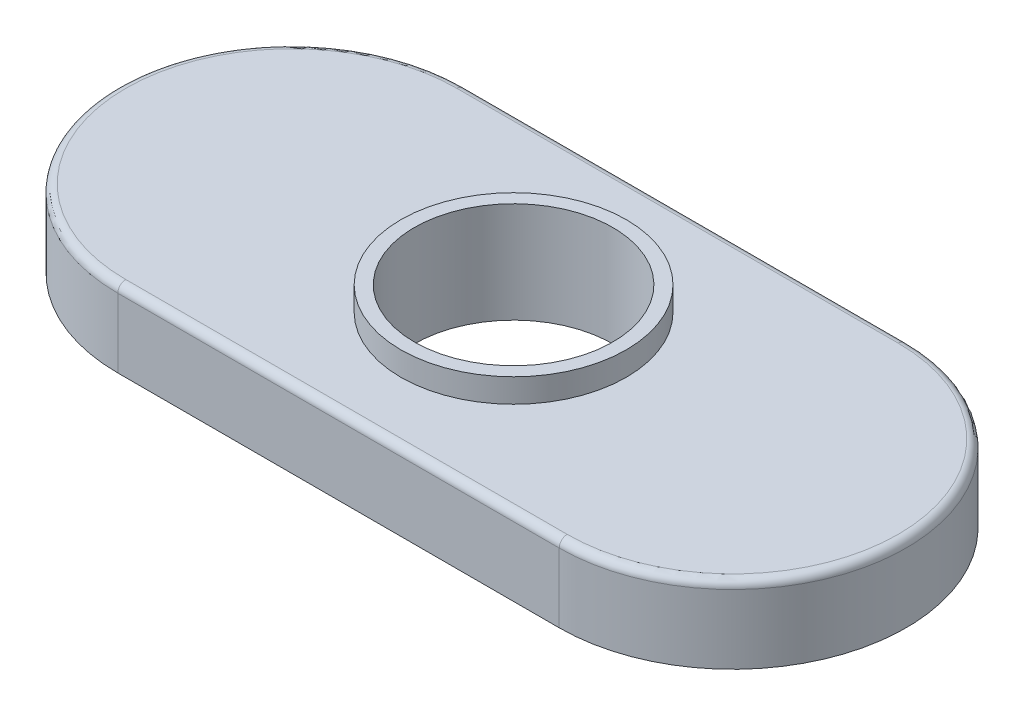
ISO-10303-21;
HEADER;
FILE_DESCRIPTION(('STEP AP214'),'2;1');
FILE_NAME('part.step','',(''),(''),'','','');
FILE_SCHEMA(('AUTOMOTIVE_DESIGN { 1 0 10303 214 1 1 1 1 }'));
ENDSEC;
DATA;
#1=APPLICATION_CONTEXT('core data for automotive mechanical design processes');
#2=APPLICATION_PROTOCOL_DEFINITION('international standard','automotive_design',2000,#1);
#3=PRODUCT_CONTEXT('',#1,'mechanical');
#4=PRODUCT('Part','Part','',(#3));
#5=PRODUCT_RELATED_PRODUCT_CATEGORY('part','',(#4));
#6=PRODUCT_DEFINITION_FORMATION('','',#4);
#7=PRODUCT_DEFINITION_CONTEXT('part definition',#1,'design');
#8=PRODUCT_DEFINITION('design','',#6,#7);
#9=PRODUCT_DEFINITION_SHAPE('','',#8);
#10=(LENGTH_UNIT() NAMED_UNIT(*) SI_UNIT(.MILLI.,.METRE.));
#11=(NAMED_UNIT(*) PLANE_ANGLE_UNIT() SI_UNIT($,.RADIAN.));
#12=(NAMED_UNIT(*) SI_UNIT($,.STERADIAN.) SOLID_ANGLE_UNIT());
#13=UNCERTAINTY_MEASURE_WITH_UNIT(LENGTH_MEASURE(1.E-05),#10,'distance_accuracy_value','');
#14=(GEOMETRIC_REPRESENTATION_CONTEXT(3) GLOBAL_UNCERTAINTY_ASSIGNED_CONTEXT((#13)) GLOBAL_UNIT_ASSIGNED_CONTEXT((#10,
#11,#12)) REPRESENTATION_CONTEXT('',''));
#15=CARTESIAN_POINT('',(0.,0.,0.));
#16=DIRECTION('',(0.,0.,1.));
#17=DIRECTION('',(1.,0.,0.));
#18=AXIS2_PLACEMENT_3D('',#15,#16,#17);
#19=CARTESIAN_POINT('',(0.,2.4638,0.));
#20=DIRECTION('',(0.,1.,0.));
#21=DIRECTION('',(0.,0.,1.));
#22=AXIS2_PLACEMENT_3D('',#19,#20,#21);
#23=PLANE('',#22);
#24=CARTESIAN_POINT('',(14.1224,2.4638,0.));
#25=DIRECTION('',(0.,1.,0.));
#26=DIRECTION('',(0.,0.,1.));
#27=AXIS2_PLACEMENT_3D('',#24,#25,#26);
#28=CIRCLE('',#27,5.2959);
#29=CARTESIAN_POINT('',(14.1224,2.4638,5.2959));
#30=VERTEX_POINT('',#29);
#31=CARTESIAN_POINT('',(14.1224,2.4638,-5.2959));
#32=VERTEX_POINT('',#31);
#33=EDGE_CURVE('E125',#30,#32,#28,.T.);
#34=ORIENTED_EDGE('',*,*,#33,.T.);
#35=DIRECTION('',(-1.,0.,0.));
#36=VECTOR('',#35,1.);
#37=CARTESIAN_POINT('',(0.,2.4638,-5.2959));
#38=LINE('',#37,#36);
#39=CARTESIAN_POINT('',(0.,2.4638,-5.2959));
#40=VERTEX_POINT('',#39);
#41=EDGE_CURVE('E127',#32,#40,#38,.T.);
#42=ORIENTED_EDGE('',*,*,#41,.T.);
#43=CARTESIAN_POINT('',(0.,2.4638,0.));
#44=DIRECTION('',(0.,1.,0.));
#45=DIRECTION('',(0.,0.,1.));
#46=AXIS2_PLACEMENT_3D('',#43,#44,#45);
#47=CIRCLE('',#46,5.2959);
#48=CARTESIAN_POINT('',(0.,2.4638,5.2959));
#49=VERTEX_POINT('',#48);
#50=EDGE_CURVE('E93',#40,#49,#47,.T.);
#51=ORIENTED_EDGE('',*,*,#50,.T.);
#52=DIRECTION('',(1.,0.,0.));
#53=VECTOR('',#52,1.);
#54=CARTESIAN_POINT('',(14.1224,2.4638,5.2959));
#55=LINE('',#54,#53);
#56=EDGE_CURVE('E123',#49,#30,#55,.T.);
#57=ORIENTED_EDGE('',*,*,#56,.T.);
#58=EDGE_LOOP('',(#34,#42,#51,#57));
#59=FACE_BOUND('',#58,.T.);
#60=CARTESIAN_POINT('',(7.112,2.4638,0.));
#61=DIRECTION('',(0.,1.,0.));
#62=DIRECTION('',(0.,0.,1.));
#63=AXIS2_PLACEMENT_3D('',#60,#61,#62);
#64=CIRCLE('',#63,3.6068);
#65=CARTESIAN_POINT('',(7.112,2.4638,-3.6068));
#66=VERTEX_POINT('',#65);
#67=EDGE_CURVE('E111',#66,#66,#64,.T.);
#68=ORIENTED_EDGE('',*,*,#67,.F.);
#69=EDGE_LOOP('',(#68));
#70=FACE_BOUND('',#69,.T.);
#71=ADVANCED_FACE('F33',(#59,#70),#23,.T.);
#72=CARTESIAN_POINT('',(0.,2.4638,0.));
#73=DIRECTION('',(0.,-1.,0.));
#74=DIRECTION('',(0.,0.,-1.));
#75=AXIS2_PLACEMENT_3D('',#72,#73,#74);
#76=CYLINDRICAL_SURFACE('',#75,5.5499);
#77=DIRECTION('',(0.,-1.,0.));
#78=VECTOR('',#77,1.);
#79=CARTESIAN_POINT('',(0.,2.4638,5.5499));
#80=LINE('',#79,#78);
#81=CARTESIAN_POINT('',(0.,2.2098,5.5499));
#82=VERTEX_POINT('',#81);
#83=CARTESIAN_POINT('',(0.,0.,5.5499));
#84=VERTEX_POINT('',#83);
#85=EDGE_CURVE('E85',#82,#84,#80,.T.);
#86=ORIENTED_EDGE('',*,*,#85,.F.);
#87=CARTESIAN_POINT('',(0.,2.2098,0.));
#88=DIRECTION('',(0.,1.,0.));
#89=DIRECTION('',(0.,0.,1.));
#90=AXIS2_PLACEMENT_3D('',#87,#88,#89);
#91=CIRCLE('',#90,5.5499);
#92=CARTESIAN_POINT('',(0.,2.2098,-5.5499));
#93=VERTEX_POINT('',#92);
#94=EDGE_CURVE('E11',#82,#93,#91,.F.);
#95=ORIENTED_EDGE('',*,*,#94,.T.);
#96=DIRECTION('',(0.,-1.,0.));
#97=VECTOR('',#96,1.);
#98=CARTESIAN_POINT('',(0.,2.4638,-5.5499));
#99=LINE('',#98,#97);
#100=CARTESIAN_POINT('',(0.,0.,-5.5499));
#101=VERTEX_POINT('',#100);
#102=EDGE_CURVE('E106',#93,#101,#99,.T.);
#103=ORIENTED_EDGE('',*,*,#102,.T.);
#104=CARTESIAN_POINT('',(0.,0.,0.));
#105=DIRECTION('',(0.,1.,0.));
#106=DIRECTION('',(0.,0.,1.));
#107=AXIS2_PLACEMENT_3D('',#104,#105,#106);
#108=CIRCLE('',#107,5.5499);
#109=EDGE_CURVE('E100',#101,#84,#108,.T.);
#110=ORIENTED_EDGE('',*,*,#109,.T.);
#111=EDGE_LOOP('',(#86,#95,#103,#110));
#112=FACE_BOUND('',#111,.T.);
#113=ADVANCED_FACE('F104',(#112),#76,.T.);
#114=CARTESIAN_POINT('',(0.,2.4638,5.5499));
#115=DIRECTION('',(0.,0.,-1.));
#116=DIRECTION('',(-1.,0.,0.));
#117=AXIS2_PLACEMENT_3D('',#114,#115,#116);
#118=PLANE('',#117);
#119=DIRECTION('',(0.,-1.,0.));
#120=VECTOR('',#119,1.);
#121=CARTESIAN_POINT('',(14.1224,2.4638,5.5499));
#122=LINE('',#121,#120);
#123=CARTESIAN_POINT('',(14.1224,2.2098,5.5499));
#124=VERTEX_POINT('',#123);
#125=CARTESIAN_POINT('',(14.1224,0.,5.5499));
#126=VERTEX_POINT('',#125);
#127=EDGE_CURVE('E94',#124,#126,#122,.T.);
#128=ORIENTED_EDGE('',*,*,#127,.F.);
#129=DIRECTION('',(1.,0.,0.));
#130=VECTOR('',#129,1.);
#131=CARTESIAN_POINT('',(0.,2.2098,5.5499));
#132=LINE('',#131,#130);
#133=EDGE_CURVE('E42',#124,#82,#132,.F.);
#134=ORIENTED_EDGE('',*,*,#133,.T.);
#135=ORIENTED_EDGE('',*,*,#85,.T.);
#136=DIRECTION('',(1.,0.,0.));
#137=VECTOR('',#136,1.);
#138=CARTESIAN_POINT('',(0.,0.,5.5499));
#139=LINE('',#138,#137);
#140=EDGE_CURVE('E88',#84,#126,#139,.T.);
#141=ORIENTED_EDGE('',*,*,#140,.T.);
#142=EDGE_LOOP('',(#128,#134,#135,#141));
#143=FACE_BOUND('',#142,.T.);
#144=ADVANCED_FACE('F87',(#143),#118,.F.);
#145=CARTESIAN_POINT('',(14.1224,2.4638,0.));
#146=DIRECTION('',(0.,-1.,0.));
#147=DIRECTION('',(0.,0.,-1.));
#148=AXIS2_PLACEMENT_3D('',#145,#146,#147);
#149=CYLINDRICAL_SURFACE('',#148,5.5499);
#150=DIRECTION('',(0.,-1.,0.));
#151=VECTOR('',#150,1.);
#152=CARTESIAN_POINT('',(14.1224,2.4638,-5.5499));
#153=LINE('',#152,#151);
#154=CARTESIAN_POINT('',(14.1224,2.2098,-5.5499));
#155=VERTEX_POINT('',#154);
#156=CARTESIAN_POINT('',(14.1224,0.,-5.5499));
#157=VERTEX_POINT('',#156);
#158=EDGE_CURVE('E119',#155,#157,#153,.T.);
#159=ORIENTED_EDGE('',*,*,#158,.F.);
#160=CARTESIAN_POINT('',(14.1224,2.2098,0.));
#161=DIRECTION('',(0.,1.,0.));
#162=DIRECTION('',(0.,0.,1.));
#163=AXIS2_PLACEMENT_3D('',#160,#161,#162);
#164=CIRCLE('',#163,5.5499);
#165=EDGE_CURVE('E57',#155,#124,#164,.F.);
#166=ORIENTED_EDGE('',*,*,#165,.T.);
#167=ORIENTED_EDGE('',*,*,#127,.T.);
#168=CARTESIAN_POINT('',(14.1224,0.,0.));
#169=DIRECTION('',(0.,1.,0.));
#170=DIRECTION('',(0.,0.,1.));
#171=AXIS2_PLACEMENT_3D('',#168,#169,#170);
#172=CIRCLE('',#171,5.5499);
#173=EDGE_CURVE('E102',#126,#157,#172,.T.);
#174=ORIENTED_EDGE('',*,*,#173,.T.);
#175=EDGE_LOOP('',(#159,#166,#167,#174));
#176=FACE_BOUND('',#175,.T.);
#177=ADVANCED_FACE('F178',(#176),#149,.T.);
#178=CARTESIAN_POINT('',(0.,2.4638,-5.5499));
#179=DIRECTION('',(0.,0.,1.));
#180=DIRECTION('',(1.,0.,0.));
#181=AXIS2_PLACEMENT_3D('',#178,#179,#180);
#182=PLANE('',#181);
#183=ORIENTED_EDGE('',*,*,#102,.F.);
#184=DIRECTION('',(-1.,0.,0.));
#185=VECTOR('',#184,1.);
#186=CARTESIAN_POINT('',(14.1224,2.2098,-5.5499));
#187=LINE('',#186,#185);
#188=EDGE_CURVE('E130',#93,#155,#187,.F.);
#189=ORIENTED_EDGE('',*,*,#188,.T.);
#190=ORIENTED_EDGE('',*,*,#158,.T.);
#191=DIRECTION('',(-1.,0.,0.));
#192=VECTOR('',#191,1.);
#193=CARTESIAN_POINT('',(0.,0.,-5.5499));
#194=LINE('',#193,#192);
#195=EDGE_CURVE('E116',#157,#101,#194,.T.);
#196=ORIENTED_EDGE('',*,*,#195,.T.);
#197=EDGE_LOOP('',(#183,#189,#190,#196));
#198=FACE_BOUND('',#197,.T.);
#199=ADVANCED_FACE('F175',(#198),#182,.F.);
#200=CARTESIAN_POINT('',(0.,0.,0.));
#201=DIRECTION('',(0.,1.,0.));
#202=DIRECTION('',(0.,0.,1.));
#203=AXIS2_PLACEMENT_3D('',#200,#201,#202);
#204=PLANE('',#203);
#205=CARTESIAN_POINT('',(7.112,0.,0.));
#206=DIRECTION('',(0.,1.,0.));
#207=DIRECTION('',(0.,0.,1.));
#208=AXIS2_PLACEMENT_3D('',#205,#206,#207);
#209=CIRCLE('',#208,3.175);
#210=CARTESIAN_POINT('',(7.112,0.,3.175));
#211=VERTEX_POINT('',#210);
#212=EDGE_CURVE('E149',#211,#211,#209,.T.);
#213=ORIENTED_EDGE('',*,*,#212,.T.);
#214=EDGE_LOOP('',(#213));
#215=FACE_BOUND('',#214,.T.);
#216=ORIENTED_EDGE('',*,*,#109,.F.);
#217=ORIENTED_EDGE('',*,*,#195,.F.);
#218=ORIENTED_EDGE('',*,*,#173,.F.);
#219=ORIENTED_EDGE('',*,*,#140,.F.);
#220=EDGE_LOOP('',(#216,#217,#218,#219));
#221=FACE_BOUND('',#220,.T.);
#222=ADVANCED_FACE('F98',(#215,#221),#204,.F.);
#223=CARTESIAN_POINT('',(7.112,3.2258,0.));
#224=DIRECTION('',(0.,-1.,0.));
#225=DIRECTION('',(0.,0.,-1.));
#226=AXIS2_PLACEMENT_3D('',#223,#224,#225);
#227=CYLINDRICAL_SURFACE('',#226,3.6068);
#228=CARTESIAN_POINT('',(7.112,3.2258,0.));
#229=DIRECTION('',(0.,1.,0.));
#230=DIRECTION('',(0.,0.,1.));
#231=AXIS2_PLACEMENT_3D('',#228,#229,#230);
#232=CIRCLE('',#231,3.6068);
#233=CARTESIAN_POINT('',(7.112,3.2258,-3.6068));
#234=VERTEX_POINT('',#233);
#235=EDGE_CURVE('E108',#234,#234,#232,.T.);
#236=CARTESIAN_POINT('',(7.112,3.2258,-3.6068));
#237=CARTESIAN_POINT('',(7.112,3.2178625,-3.6068));
#238=CARTESIAN_POINT('',(7.112,3.209925,-3.6068));
#239=CARTESIAN_POINT('',(7.112,3.19405,-3.6068));
#240=CARTESIAN_POINT('',(7.112,3.1861125,-3.6068));
#241=CARTESIAN_POINT('',(7.112,3.1702375,-3.6068));
#242=CARTESIAN_POINT('',(7.112,3.1623,-3.6068));
#243=CARTESIAN_POINT('',(7.112,3.146425,-3.6068));
#244=CARTESIAN_POINT('',(7.112,3.1384875,-3.6068));
#245=CARTESIAN_POINT('',(7.112,3.1226125,-3.6068));
#246=CARTESIAN_POINT('',(7.112,3.114675,-3.6068));
#247=CARTESIAN_POINT('',(7.112,3.0988,-3.6068));
#248=CARTESIAN_POINT('',(7.112,3.0908625,-3.6068));
#249=CARTESIAN_POINT('',(7.112,3.0749875,-3.6068));
#250=CARTESIAN_POINT('',(7.112,3.06705,-3.6068));
#251=CARTESIAN_POINT('',(7.112,3.051175,-3.6068));
#252=CARTESIAN_POINT('',(7.112,3.0432375,-3.6068));
#253=CARTESIAN_POINT('',(7.112,3.0273625,-3.6068));
#254=CARTESIAN_POINT('',(7.112,3.019425,-3.6068));
#255=CARTESIAN_POINT('',(7.112,3.00355,-3.6068));
#256=CARTESIAN_POINT('',(7.112,2.9956125,-3.6068));
#257=CARTESIAN_POINT('',(7.112,2.9797375,-3.6068));
#258=CARTESIAN_POINT('',(7.112,2.9718,-3.6068));
#259=CARTESIAN_POINT('',(7.112,2.955925,-3.6068));
#260=CARTESIAN_POINT('',(7.112,2.9479875,-3.6068));
#261=CARTESIAN_POINT('',(7.112,2.9321125,-3.6068));
#262=CARTESIAN_POINT('',(7.112,2.924175,-3.6068));
#263=CARTESIAN_POINT('',(7.112,2.9083,-3.6068));
#264=CARTESIAN_POINT('',(7.112,2.9003625,-3.6068));
#265=CARTESIAN_POINT('',(7.112,2.8844875,-3.6068));
#266=CARTESIAN_POINT('',(7.112,2.87655,-3.6068));
#267=CARTESIAN_POINT('',(7.112,2.860675,-3.6068));
#268=CARTESIAN_POINT('',(7.112,2.8527375,-3.6068));
#269=CARTESIAN_POINT('',(7.112,2.8368625,-3.6068));
#270=CARTESIAN_POINT('',(7.112,2.828925,-3.6068));
#271=CARTESIAN_POINT('',(7.112,2.81305,-3.6068));
#272=CARTESIAN_POINT('',(7.112,2.8051125,-3.6068));
#273=CARTESIAN_POINT('',(7.112,2.7892375,-3.6068));
#274=CARTESIAN_POINT('',(7.112,2.7813,-3.6068));
#275=CARTESIAN_POINT('',(7.112,2.765425,-3.6068));
#276=CARTESIAN_POINT('',(7.112,2.7574875,-3.6068));
#277=CARTESIAN_POINT('',(7.112,2.7416125,-3.6068));
#278=CARTESIAN_POINT('',(7.112,2.733675,-3.6068));
#279=CARTESIAN_POINT('',(7.112,2.7178,-3.6068));
#280=CARTESIAN_POINT('',(7.112,2.7098625,-3.6068));
#281=CARTESIAN_POINT('',(7.112,2.6939875,-3.6068));
#282=CARTESIAN_POINT('',(7.112,2.68605,-3.6068));
#283=CARTESIAN_POINT('',(7.112,2.670175,-3.6068));
#284=CARTESIAN_POINT('',(7.112,2.6622375,-3.6068));
#285=CARTESIAN_POINT('',(7.112,2.6463625,-3.6068));
#286=CARTESIAN_POINT('',(7.112,2.638425,-3.6068));
#287=CARTESIAN_POINT('',(7.112,2.62255,-3.6068));
#288=CARTESIAN_POINT('',(7.112,2.6146125,-3.6068));
#289=CARTESIAN_POINT('',(7.112,2.5987375,-3.6068));
#290=CARTESIAN_POINT('',(7.112,2.5908,-3.6068));
#291=CARTESIAN_POINT('',(7.112,2.574925,-3.6068));
#292=CARTESIAN_POINT('',(7.112,2.5669875,-3.6068));
#293=CARTESIAN_POINT('',(7.112,2.5511125,-3.6068));
#294=CARTESIAN_POINT('',(7.112,2.543175,-3.6068));
#295=CARTESIAN_POINT('',(7.112,2.5273,-3.6068));
#296=CARTESIAN_POINT('',(7.112,2.5193625,-3.6068));
#297=CARTESIAN_POINT('',(7.112,2.5034875,-3.6068));
#298=CARTESIAN_POINT('',(7.112,2.49555,-3.6068));
#299=CARTESIAN_POINT('',(7.112,2.479675,-3.6068));
#300=CARTESIAN_POINT('',(7.112,2.4717375,-3.6068));
#301=CARTESIAN_POINT('',(7.112,2.4638,-3.6068));
#302=B_SPLINE_CURVE_WITH_KNOTS('',3,(#236,#237,#238,#239,#240,#241,#242,#243,#244,#245,#246,
#247,#248,#249,#250,#251,#252,#253,#254,#255,#256,#257,#258,#259,#260,#261,#262,#263,#264,#265,
#266,#267,#268,#269,#270,#271,#272,#273,#274,#275,#276,#277,#278,#279,#280,#281,#282,#283,#284,
#285,#286,#287,#288,#289,#290,#291,#292,#293,#294,#295,#296,#297,#298,#299,#300,#301),
.UNSPECIFIED.,.F.,.F.,(4,2,2,2,2,2,2,2,2,2,2,2,2,2,2,2,2,2,2,2,2,2,2,2,2,2,2,2,2,2,2,2,4),(0.,
0.0238125000000004,0.0476250000000004,0.0714375000000003,0.0952500000000003,0.1190625,0.142875,
0.1666875,0.1905,0.2143125,0.238125,0.2619375,0.28575,0.3095625,0.333375,0.3571875,0.381,
0.4048125,0.428625,0.4524375,0.47625,0.5000625,0.523875,0.5476875,0.5715,0.5953125,0.619125,
0.6429375,0.66675,0.6905625,0.714375,0.7381875,0.762),.UNSPECIFIED.);
#303=EDGE_CURVE('BSEAM160',#234,#66,#302,.T.);
#304=ORIENTED_EDGE('',*,*,#235,.F.);
#305=ORIENTED_EDGE('',*,*,#67,.T.);
#306=ORIENTED_EDGE('',*,*,#303,.T.);
#307=ORIENTED_EDGE('',*,*,#303,.F.);
#308=EDGE_LOOP('',(#304,#306,#305,#307));
#309=FACE_BOUND('',#308,.T.);
#310=ADVANCED_FACE('F160',(#309),#227,.T.);
#311=CARTESIAN_POINT('',(7.112,3.2258,0.));
#312=DIRECTION('',(0.,1.,0.));
#313=DIRECTION('',(0.,0.,1.));
#314=AXIS2_PLACEMENT_3D('',#311,#312,#313);
#315=PLANE('',#314);
#316=CARTESIAN_POINT('',(7.112,3.2258,0.));
#317=DIRECTION('',(0.,1.,0.));
#318=DIRECTION('',(0.,0.,1.));
#319=AXIS2_PLACEMENT_3D('',#316,#317,#318);
#320=CIRCLE('',#319,3.175);
#321=CARTESIAN_POINT('',(7.112,3.2258,3.175));
#322=VERTEX_POINT('',#321);
#323=EDGE_CURVE('E144',#322,#322,#320,.T.);
#324=ORIENTED_EDGE('',*,*,#323,.F.);
#325=EDGE_LOOP('',(#324));
#326=FACE_BOUND('',#325,.T.);
#327=ORIENTED_EDGE('',*,*,#235,.T.);
#328=EDGE_LOOP('',(#327));
#329=FACE_BOUND('',#328,.T.);
#330=ADVANCED_FACE('F200',(#326,#329),#315,.T.);
#331=CARTESIAN_POINT('',(7.112,0.,0.));
#332=DIRECTION('',(0.,1.,0.));
#333=DIRECTION('',(0.,0.,1.));
#334=AXIS2_PLACEMENT_3D('',#331,#332,#333);
#335=CYLINDRICAL_SURFACE('',#334,3.175);
#336=ORIENTED_EDGE('',*,*,#212,.F.);
#337=EDGE_LOOP('',(#336));
#338=FACE_BOUND('',#337,.T.);
#339=ORIENTED_EDGE('',*,*,#323,.T.);
#340=EDGE_LOOP('',(#339));
#341=FACE_BOUND('',#340,.T.);
#342=ADVANCED_FACE('F195',(#338,#341),#335,.F.);
#343=CARTESIAN_POINT('',(0.,2.2098,5.2959));
#344=DIRECTION('',(-1.,0.,0.));
#345=DIRECTION('',(0.,0.,1.));
#346=AXIS2_PLACEMENT_3D('',#343,#344,#345);
#347=CYLINDRICAL_SURFACE('',#346,0.254);
#348=CARTESIAN_POINT('',(0.,2.2098,5.2959));
#349=DIRECTION('',(-1.,0.,0.));
#350=DIRECTION('',(0.,0.,1.));
#351=AXIS2_PLACEMENT_3D('',#348,#349,#350);
#352=CIRCLE('',#351,0.254);
#353=EDGE_CURVE('E138',#82,#49,#352,.T.);
#354=ORIENTED_EDGE('',*,*,#353,.F.);
#355=ORIENTED_EDGE('',*,*,#133,.F.);
#356=CARTESIAN_POINT('',(14.1224,2.2098,5.2959));
#357=DIRECTION('',(1.,0.,0.));
#358=DIRECTION('',(0.,0.,-1.));
#359=AXIS2_PLACEMENT_3D('',#356,#357,#358);
#360=CIRCLE('',#359,0.254);
#361=EDGE_CURVE('E37',#30,#124,#360,.T.);
#362=ORIENTED_EDGE('',*,*,#361,.F.);
#363=ORIENTED_EDGE('',*,*,#56,.F.);
#364=EDGE_LOOP('',(#354,#355,#362,#363));
#365=FACE_BOUND('',#364,.T.);
#366=ADVANCED_FACE('F35',(#365),#347,.T.);
#367=CARTESIAN_POINT('',(14.1224,2.2098,0.));
#368=DIRECTION('',(0.,1.,0.));
#369=DIRECTION('',(0.,0.,1.));
#370=AXIS2_PLACEMENT_3D('',#367,#368,#369);
#371=TOROIDAL_SURFACE('',#370,5.2959,0.254);
#372=ORIENTED_EDGE('',*,*,#361,.T.);
#373=ORIENTED_EDGE('',*,*,#165,.F.);
#374=CARTESIAN_POINT('',(14.1224,2.2098,-5.2959));
#375=DIRECTION('',(-1.,0.,0.));
#376=DIRECTION('',(0.,0.,1.));
#377=AXIS2_PLACEMENT_3D('',#374,#375,#376);
#378=CIRCLE('',#377,0.254);
#379=EDGE_CURVE('E137',#32,#155,#378,.T.);
#380=ORIENTED_EDGE('',*,*,#379,.F.);
#381=ORIENTED_EDGE('',*,*,#33,.F.);
#382=EDGE_LOOP('',(#372,#373,#380,#381));
#383=FACE_BOUND('',#382,.T.);
#384=ADVANCED_FACE('F190',(#383),#371,.T.);
#385=CARTESIAN_POINT('',(0.,2.2098,0.));
#386=DIRECTION('',(0.,1.,0.));
#387=DIRECTION('',(0.,0.,1.));
#388=AXIS2_PLACEMENT_3D('',#385,#386,#387);
#389=TOROIDAL_SURFACE('',#388,5.2959,0.254);
#390=ORIENTED_EDGE('',*,*,#353,.T.);
#391=ORIENTED_EDGE('',*,*,#50,.F.);
#392=CARTESIAN_POINT('',(0.,2.2098,-5.2959));
#393=DIRECTION('',(1.,0.,0.));
#394=DIRECTION('',(0.,0.,-1.));
#395=AXIS2_PLACEMENT_3D('',#392,#393,#394);
#396=CIRCLE('',#395,0.254);
#397=EDGE_CURVE('E135',#93,#40,#396,.T.);
#398=ORIENTED_EDGE('',*,*,#397,.F.);
#399=ORIENTED_EDGE('',*,*,#94,.F.);
#400=EDGE_LOOP('',(#390,#391,#398,#399));
#401=FACE_BOUND('',#400,.T.);
#402=ADVANCED_FACE('F187',(#401),#389,.T.);
#403=CARTESIAN_POINT('',(0.,2.2098,-5.2959));
#404=DIRECTION('',(1.,0.,0.));
#405=DIRECTION('',(0.,0.,-1.));
#406=AXIS2_PLACEMENT_3D('',#403,#404,#405);
#407=CYLINDRICAL_SURFACE('',#406,0.254);
#408=ORIENTED_EDGE('',*,*,#379,.T.);
#409=ORIENTED_EDGE('',*,*,#188,.F.);
#410=ORIENTED_EDGE('',*,*,#397,.T.);
#411=ORIENTED_EDGE('',*,*,#41,.F.);
#412=EDGE_LOOP('',(#408,#409,#410,#411));
#413=FACE_BOUND('',#412,.T.);
#414=ADVANCED_FACE('F184',(#413),#407,.T.);
#415=CLOSED_SHELL('',(#71,#113,#144,#177,#199,#222,#310,#330,#342,#366,#384,#402,#414));
#416=MANIFOLD_SOLID_BREP('B2',#415);
#417=ADVANCED_BREP_SHAPE_REPRESENTATION('',(#18,#416),#14);
#418=SHAPE_DEFINITION_REPRESENTATION(#9,#417);
ENDSEC;
END-ISO-10303-21;
